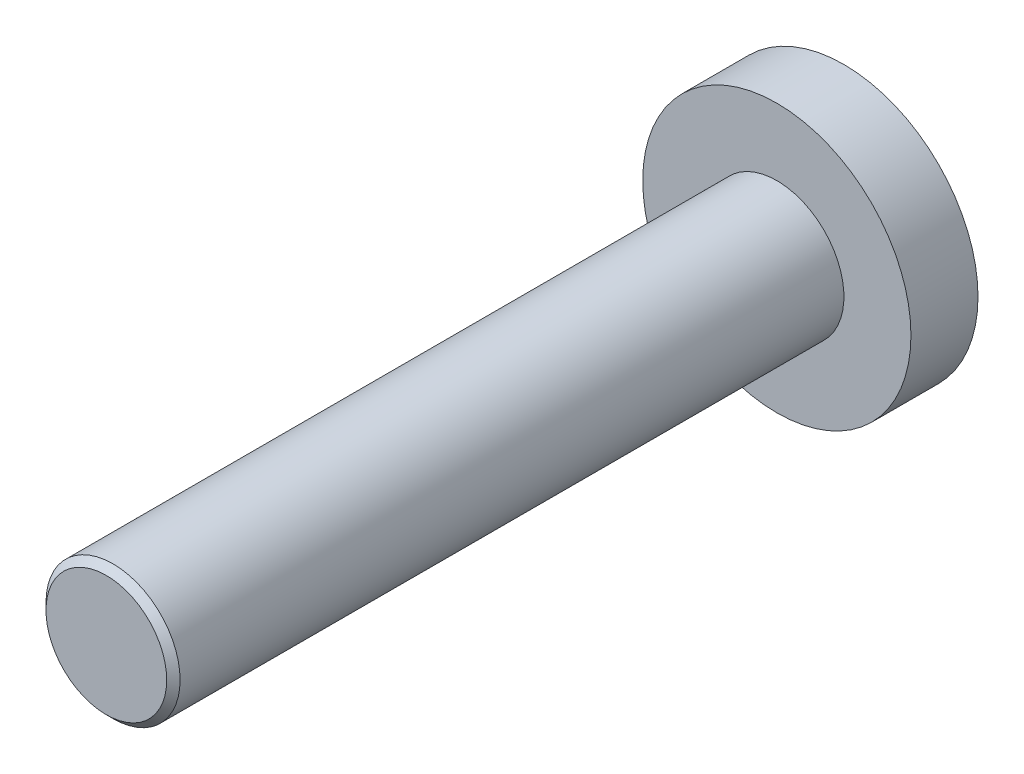
ISO-10303-21;
HEADER;
FILE_DESCRIPTION(('STEP AP214'),'2;1');
FILE_NAME('part.step','',(''),(''),'','','');
FILE_SCHEMA(('AUTOMOTIVE_DESIGN { 1 0 10303 214 1 1 1 1 }'));
ENDSEC;
DATA;
#1=APPLICATION_CONTEXT('core data for automotive mechanical design processes');
#2=APPLICATION_PROTOCOL_DEFINITION('international standard','automotive_design',2000,#1);
#3=PRODUCT_CONTEXT('',#1,'mechanical');
#4=PRODUCT('Part','Part','',(#3));
#5=PRODUCT_RELATED_PRODUCT_CATEGORY('part','',(#4));
#6=PRODUCT_DEFINITION_FORMATION('','',#4);
#7=PRODUCT_DEFINITION_CONTEXT('part definition',#1,'design');
#8=PRODUCT_DEFINITION('design','',#6,#7);
#9=PRODUCT_DEFINITION_SHAPE('','',#8);
#10=(LENGTH_UNIT() NAMED_UNIT(*) SI_UNIT(.MILLI.,.METRE.));
#11=(NAMED_UNIT(*) PLANE_ANGLE_UNIT() SI_UNIT($,.RADIAN.));
#12=(NAMED_UNIT(*) SI_UNIT($,.STERADIAN.) SOLID_ANGLE_UNIT());
#13=UNCERTAINTY_MEASURE_WITH_UNIT(LENGTH_MEASURE(1.E-05),#10,'distance_accuracy_value','');
#14=(GEOMETRIC_REPRESENTATION_CONTEXT(3) GLOBAL_UNCERTAINTY_ASSIGNED_CONTEXT((#13)) GLOBAL_UNIT_ASSIGNED_CONTEXT((#10,
#11,#12)) REPRESENTATION_CONTEXT('',''));
#15=CARTESIAN_POINT('',(0.,0.,0.));
#16=DIRECTION('',(0.,0.,1.));
#17=DIRECTION('',(1.,0.,0.));
#18=AXIS2_PLACEMENT_3D('',#15,#16,#17);
#19=CARTESIAN_POINT('',(0.,0.,20.));
#20=DIRECTION('',(0.,0.,-1.));
#21=DIRECTION('',(-1.,0.,0.));
#22=AXIS2_PLACEMENT_3D('',#19,#20,#21);
#23=CYLINDRICAL_SURFACE('',#22,2.);
#24=CARTESIAN_POINT('',(0.,0.,19.8));
#25=DIRECTION('',(0.,0.,1.));
#26=DIRECTION('',(1.,0.,0.));
#27=AXIS2_PLACEMENT_3D('',#24,#25,#26);
#28=CIRCLE('',#27,2.);
#29=CARTESIAN_POINT('',(2.,0.,19.8));
#30=VERTEX_POINT('',#29);
#31=EDGE_CURVE('E10',#30,#30,#28,.F.);
#32=ORIENTED_EDGE('',*,*,#31,.T.);
#33=EDGE_LOOP('',(#32));
#34=FACE_BOUND('',#33,.T.);
#35=CARTESIAN_POINT('',(0.,0.,0.));
#36=DIRECTION('',(0.,0.,-1.));
#37=DIRECTION('',(-1.,0.,0.));
#38=AXIS2_PLACEMENT_3D('',#35,#36,#37);
#39=CIRCLE('',#38,2.);
#40=CARTESIAN_POINT('',(-2.,0.,0.));
#41=VERTEX_POINT('',#40);
#42=EDGE_CURVE('E41',#41,#41,#39,.T.);
#43=ORIENTED_EDGE('',*,*,#42,.F.);
#44=EDGE_LOOP('',(#43));
#45=FACE_BOUND('',#44,.T.);
#46=ADVANCED_FACE('F30',(#34,#45),#23,.T.);
#47=CARTESIAN_POINT('',(0.,0.,20.));
#48=DIRECTION('',(0.,0.,1.));
#49=DIRECTION('',(1.,0.,0.));
#50=AXIS2_PLACEMENT_3D('',#47,#48,#49);
#51=PLANE('',#50);
#52=CARTESIAN_POINT('',(0.,0.,20.));
#53=DIRECTION('',(0.,0.,1.));
#54=DIRECTION('',(1.,0.,0.));
#55=AXIS2_PLACEMENT_3D('',#52,#53,#54);
#56=CIRCLE('',#55,1.79999999999999);
#57=CARTESIAN_POINT('',(1.79999999999999,0.,20.));
#58=VERTEX_POINT('',#57);
#59=EDGE_CURVE('E37',#58,#58,#56,.T.);
#60=ORIENTED_EDGE('',*,*,#59,.T.);
#61=EDGE_LOOP('',(#60));
#62=FACE_BOUND('',#61,.T.);
#63=ADVANCED_FACE('F65',(#62),#51,.T.);
#64=CARTESIAN_POINT('',(0.,0.,0.));
#65=DIRECTION('',(0.,0.,-1.));
#66=DIRECTION('',(-1.,0.,0.));
#67=AXIS2_PLACEMENT_3D('',#64,#65,#66);
#68=PLANE('',#67);
#69=CARTESIAN_POINT('',(0.,0.,0.));
#70=DIRECTION('',(0.,0.,-1.));
#71=DIRECTION('',(-1.,0.,0.));
#72=AXIS2_PLACEMENT_3D('',#69,#70,#71);
#73=CIRCLE('',#72,4.);
#74=CARTESIAN_POINT('',(-4.,0.,0.));
#75=VERTEX_POINT('',#74);
#76=EDGE_CURVE('E48',#75,#75,#73,.T.);
#77=ORIENTED_EDGE('',*,*,#76,.F.);
#78=EDGE_LOOP('',(#77));
#79=FACE_BOUND('',#78,.T.);
#80=ORIENTED_EDGE('',*,*,#42,.T.);
#81=EDGE_LOOP('',(#80));
#82=FACE_BOUND('',#81,.T.);
#83=ADVANCED_FACE('F59',(#79,#82),#68,.F.);
#84=CARTESIAN_POINT('',(0.,0.,-2.));
#85=DIRECTION('',(0.,0.,1.));
#86=DIRECTION('',(1.,0.,0.));
#87=AXIS2_PLACEMENT_3D('',#84,#85,#86);
#88=CYLINDRICAL_SURFACE('',#87,4.);
#89=CARTESIAN_POINT('',(0.,0.,-2.));
#90=DIRECTION('',(0.,0.,-1.));
#91=DIRECTION('',(-1.,0.,0.));
#92=AXIS2_PLACEMENT_3D('',#89,#90,#91);
#93=CIRCLE('',#92,4.);
#94=CARTESIAN_POINT('',(-4.,0.,-2.));
#95=VERTEX_POINT('',#94);
#96=EDGE_CURVE('E45',#95,#95,#93,.T.);
#97=ORIENTED_EDGE('',*,*,#96,.F.);
#98=EDGE_LOOP('',(#97));
#99=FACE_BOUND('',#98,.T.);
#100=ORIENTED_EDGE('',*,*,#76,.T.);
#101=EDGE_LOOP('',(#100));
#102=FACE_BOUND('',#101,.T.);
#103=ADVANCED_FACE('F56',(#99,#102),#88,.T.);
#104=CARTESIAN_POINT('',(0.,0.,-2.));
#105=DIRECTION('',(0.,0.,-1.));
#106=DIRECTION('',(-1.,0.,0.));
#107=AXIS2_PLACEMENT_3D('',#104,#105,#106);
#108=PLANE('',#107);
#109=ORIENTED_EDGE('',*,*,#96,.T.);
#110=EDGE_LOOP('',(#109));
#111=FACE_BOUND('',#110,.T.);
#112=ADVANCED_FACE('F54',(#111),#108,.T.);
#113=CARTESIAN_POINT('',(0.,0.,20.));
#114=DIRECTION('',(0.,0.,-1.));
#115=DIRECTION('',(-1.,0.,0.));
#116=AXIS2_PLACEMENT_3D('',#113,#114,#115);
#117=CONICAL_SURFACE('',#116,1.79999999999999,0.785398163397444);
#118=ORIENTED_EDGE('',*,*,#31,.F.);
#119=EDGE_LOOP('',(#118));
#120=FACE_BOUND('',#119,.T.);
#121=ORIENTED_EDGE('',*,*,#59,.F.);
#122=EDGE_LOOP('',(#121));
#123=FACE_BOUND('',#122,.T.);
#124=ADVANCED_FACE('F32',(#120,#123),#117,.T.);
#125=CLOSED_SHELL('',(#46,#63,#83,#103,#112,#124));
#126=MANIFOLD_SOLID_BREP('B2',#125);
#127=ADVANCED_BREP_SHAPE_REPRESENTATION('',(#18,#126),#14);
#128=SHAPE_DEFINITION_REPRESENTATION(#9,#127);
ENDSEC;
END-ISO-10303-21;
